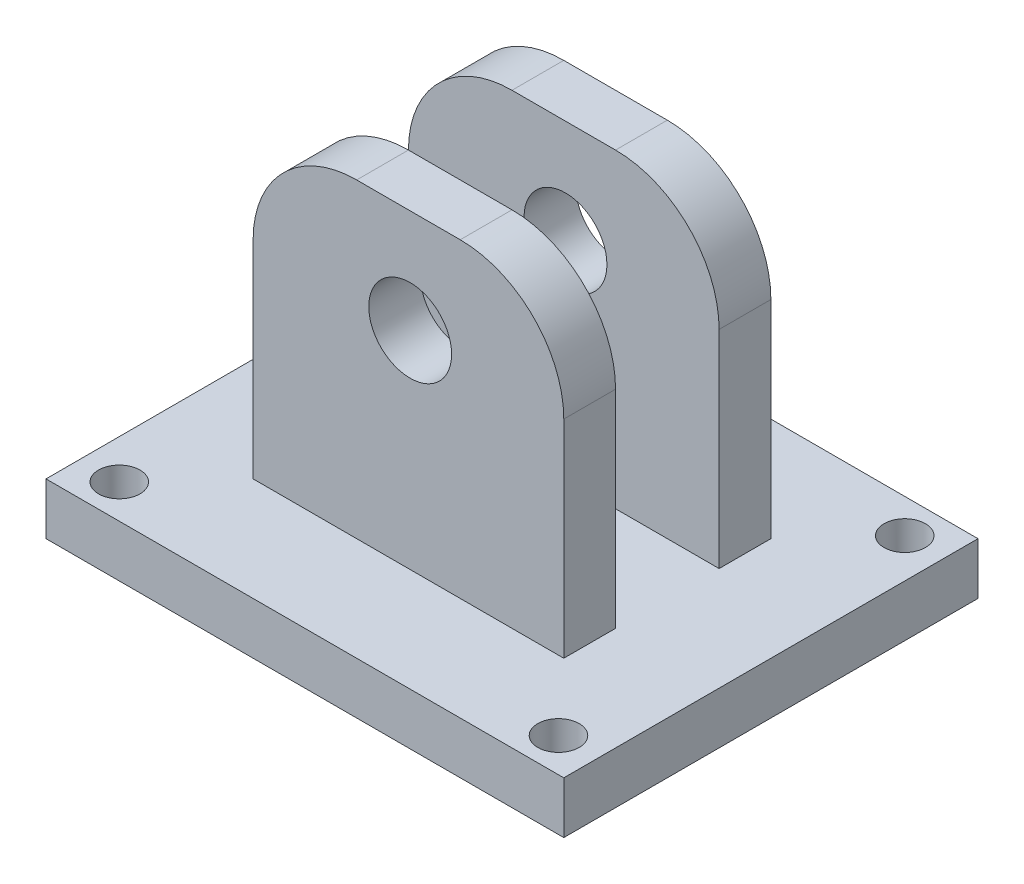
ISO-10303-21;
HEADER;
FILE_DESCRIPTION(('STEP AP214'),'2;1');
FILE_NAME('part.step','',(''),(''),'','','');
FILE_SCHEMA(('AUTOMOTIVE_DESIGN { 1 0 10303 214 1 1 1 1 }'));
ENDSEC;
DATA;
#1=APPLICATION_CONTEXT('core data for automotive mechanical design processes');
#2=APPLICATION_PROTOCOL_DEFINITION('international standard','automotive_design',2000,#1);
#3=PRODUCT_CONTEXT('',#1,'mechanical');
#4=PRODUCT('Part','Part','',(#3));
#5=PRODUCT_RELATED_PRODUCT_CATEGORY('part','',(#4));
#6=PRODUCT_DEFINITION_FORMATION('','',#4);
#7=PRODUCT_DEFINITION_CONTEXT('part definition',#1,'design');
#8=PRODUCT_DEFINITION('design','',#6,#7);
#9=PRODUCT_DEFINITION_SHAPE('','',#8);
#10=(LENGTH_UNIT() NAMED_UNIT(*) SI_UNIT(.MILLI.,.METRE.));
#11=(NAMED_UNIT(*) PLANE_ANGLE_UNIT() SI_UNIT($,.RADIAN.));
#12=(NAMED_UNIT(*) SI_UNIT($,.STERADIAN.) SOLID_ANGLE_UNIT());
#13=UNCERTAINTY_MEASURE_WITH_UNIT(LENGTH_MEASURE(1.E-05),#10,'distance_accuracy_value','');
#14=(GEOMETRIC_REPRESENTATION_CONTEXT(3) GLOBAL_UNCERTAINTY_ASSIGNED_CONTEXT((#13)) GLOBAL_UNIT_ASSIGNED_CONTEXT((#10,
#11,#12)) REPRESENTATION_CONTEXT('',''));
#15=CARTESIAN_POINT('',(0.,0.,0.));
#16=DIRECTION('',(0.,0.,1.));
#17=DIRECTION('',(1.,0.,0.));
#18=AXIS2_PLACEMENT_3D('',#15,#16,#17);
#19=CARTESIAN_POINT('',(7.66798418972334,25.,-2.15415019762846));
#20=DIRECTION('',(0.,0.,-1.));
#21=DIRECTION('',(-1.,0.,0.));
#22=AXIS2_PLACEMENT_3D('',#19,#20,#21);
#23=CYLINDRICAL_SURFACE('',#22,10.);
#24=DIRECTION('',(0.,0.,1.));
#25=VECTOR('',#24,1.);
#26=CARTESIAN_POINT('',(17.6679841897233,25.,-2.15415019762846));
#27=LINE('',#26,#25);
#28=CARTESIAN_POINT('',(17.6679841897233,25.,-2.15415019762846));
#29=VERTEX_POINT('',#28);
#30=CARTESIAN_POINT('',(17.6679841897233,25.,2.84584980237154));
#31=VERTEX_POINT('',#30);
#32=EDGE_CURVE('E263',#29,#31,#27,.T.);
#33=ORIENTED_EDGE('',*,*,#32,.F.);
#34=CARTESIAN_POINT('',(7.66798418972334,25.,-2.15415019762846));
#35=DIRECTION('',(0.,0.,1.));
#36=DIRECTION('',(1.,0.,0.));
#37=AXIS2_PLACEMENT_3D('',#34,#35,#36);
#38=CIRCLE('',#37,10.);
#39=CARTESIAN_POINT('',(7.66798418972334,35.,-2.15415019762846));
#40=VERTEX_POINT('',#39);
#41=EDGE_CURVE('E40',#40,#29,#38,.F.);
#42=ORIENTED_EDGE('',*,*,#41,.F.);
#43=DIRECTION('',(0.,0.,1.));
#44=VECTOR('',#43,1.);
#45=CARTESIAN_POINT('',(7.66798418972334,35.,-2.15415019762846));
#46=LINE('',#45,#44);
#47=CARTESIAN_POINT('',(7.66798418972334,35.,2.84584980237154));
#48=VERTEX_POINT('',#47);
#49=EDGE_CURVE('E266',#48,#40,#46,.F.);
#50=ORIENTED_EDGE('',*,*,#49,.F.);
#51=CARTESIAN_POINT('',(7.66798418972334,25.,2.84584980237154));
#52=DIRECTION('',(0.,0.,-1.));
#53=DIRECTION('',(-1.,0.,0.));
#54=AXIS2_PLACEMENT_3D('',#51,#52,#53);
#55=CIRCLE('',#54,10.);
#56=EDGE_CURVE('E11',#31,#48,#55,.F.);
#57=ORIENTED_EDGE('',*,*,#56,.F.);
#58=EDGE_LOOP('',(#33,#42,#50,#57));
#59=FACE_BOUND('',#58,.T.);
#60=ADVANCED_FACE('F32',(#59),#23,.T.);
#61=CARTESIAN_POINT('',(-2.33201581027666,25.,-2.15415019762846));
#62=DIRECTION('',(0.,0.,1.));
#63=DIRECTION('',(1.,0.,0.));
#64=AXIS2_PLACEMENT_3D('',#61,#62,#63);
#65=CYLINDRICAL_SURFACE('',#64,10.);
#66=DIRECTION('',(0.,0.,-1.));
#67=VECTOR('',#66,1.);
#68=CARTESIAN_POINT('',(-12.3320158102767,25.,-2.15415019762846));
#69=LINE('',#68,#67);
#70=CARTESIAN_POINT('',(-12.3320158102767,25.,2.84584980237154));
#71=VERTEX_POINT('',#70);
#72=CARTESIAN_POINT('',(-12.3320158102767,25.,-2.15415019762846));
#73=VERTEX_POINT('',#72);
#74=EDGE_CURVE('E153',#71,#73,#69,.T.);
#75=ORIENTED_EDGE('',*,*,#74,.F.);
#76=CARTESIAN_POINT('',(-2.33201581027666,25.,2.84584980237154));
#77=DIRECTION('',(0.,0.,-1.));
#78=DIRECTION('',(-1.,0.,0.));
#79=AXIS2_PLACEMENT_3D('',#76,#77,#78);
#80=CIRCLE('',#79,10.);
#81=CARTESIAN_POINT('',(-2.33201581027666,35.,2.84584980237154));
#82=VERTEX_POINT('',#81);
#83=EDGE_CURVE('E259',#82,#71,#80,.F.);
#84=ORIENTED_EDGE('',*,*,#83,.F.);
#85=DIRECTION('',(0.,0.,-1.));
#86=VECTOR('',#85,1.);
#87=CARTESIAN_POINT('',(-2.33201581027666,35.,-2.15415019762846));
#88=LINE('',#87,#86);
#89=CARTESIAN_POINT('',(-2.33201581027666,35.,-2.15415019762846));
#90=VERTEX_POINT('',#89);
#91=EDGE_CURVE('E256',#90,#82,#88,.F.);
#92=ORIENTED_EDGE('',*,*,#91,.F.);
#93=CARTESIAN_POINT('',(-2.33201581027666,25.,-2.15415019762846));
#94=DIRECTION('',(0.,0.,1.));
#95=DIRECTION('',(1.,0.,0.));
#96=AXIS2_PLACEMENT_3D('',#93,#94,#95);
#97=CIRCLE('',#96,10.);
#98=EDGE_CURVE('E261',#73,#90,#97,.F.);
#99=ORIENTED_EDGE('',*,*,#98,.F.);
#100=EDGE_LOOP('',(#75,#84,#92,#99));
#101=FACE_BOUND('',#100,.T.);
#102=ADVANCED_FACE('F314',(#101),#65,.T.);
#103=CARTESIAN_POINT('',(-2.33201581027666,25.,0.));
#104=DIRECTION('',(0.,0.,-1.));
#105=DIRECTION('',(-1.,0.,0.));
#106=AXIS2_PLACEMENT_3D('',#103,#104,#105);
#107=CYLINDRICAL_SURFACE('',#106,10.);
#108=DIRECTION('',(0.,0.,1.));
#109=VECTOR('',#108,1.);
#110=CARTESIAN_POINT('',(-2.33201581027666,35.,0.));
#111=LINE('',#110,#109);
#112=CARTESIAN_POINT('',(-2.33201581027666,35.,12.8458498023715));
#113=VERTEX_POINT('',#112);
#114=CARTESIAN_POINT('',(-2.33201581027666,35.,17.8458498023715));
#115=VERTEX_POINT('',#114);
#116=EDGE_CURVE('E245',#113,#115,#111,.T.);
#117=ORIENTED_EDGE('',*,*,#116,.F.);
#118=CARTESIAN_POINT('',(-2.33201581027666,25.,12.8458498023715));
#119=DIRECTION('',(0.,0.,1.));
#120=DIRECTION('',(1.,0.,0.));
#121=AXIS2_PLACEMENT_3D('',#118,#119,#120);
#122=CIRCLE('',#121,10.);
#123=CARTESIAN_POINT('',(-12.3320158102767,25.,12.8458498023715));
#124=VERTEX_POINT('',#123);
#125=EDGE_CURVE('E251',#124,#113,#122,.F.);
#126=ORIENTED_EDGE('',*,*,#125,.F.);
#127=DIRECTION('',(0.,0.,1.));
#128=VECTOR('',#127,1.);
#129=CARTESIAN_POINT('',(-12.3320158102767,25.,0.));
#130=LINE('',#129,#128);
#131=CARTESIAN_POINT('',(-12.3320158102767,25.,17.8458498023715));
#132=VERTEX_POINT('',#131);
#133=EDGE_CURVE('E248',#132,#124,#130,.F.);
#134=ORIENTED_EDGE('',*,*,#133,.F.);
#135=CARTESIAN_POINT('',(-2.33201581027666,25.,17.8458498023715));
#136=DIRECTION('',(0.,0.,-1.));
#137=DIRECTION('',(-1.,0.,0.));
#138=AXIS2_PLACEMENT_3D('',#135,#136,#137);
#139=CIRCLE('',#138,10.);
#140=EDGE_CURVE('E253',#115,#132,#139,.F.);
#141=ORIENTED_EDGE('',*,*,#140,.F.);
#142=EDGE_LOOP('',(#117,#126,#134,#141));
#143=FACE_BOUND('',#142,.T.);
#144=ADVANCED_FACE('F321',(#143),#107,.T.);
#145=CARTESIAN_POINT('',(7.66798418972334,25.,0.));
#146=DIRECTION('',(0.,0.,1.));
#147=DIRECTION('',(1.,0.,0.));
#148=AXIS2_PLACEMENT_3D('',#145,#146,#147);
#149=CYLINDRICAL_SURFACE('',#148,10.);
#150=DIRECTION('',(0.,0.,-1.));
#151=VECTOR('',#150,1.);
#152=CARTESIAN_POINT('',(7.66798418972334,35.,0.));
#153=LINE('',#152,#151);
#154=CARTESIAN_POINT('',(7.66798418972334,35.,17.8458498023715));
#155=VERTEX_POINT('',#154);
#156=CARTESIAN_POINT('',(7.66798418972334,35.,12.8458498023715));
#157=VERTEX_POINT('',#156);
#158=EDGE_CURVE('E234',#155,#157,#153,.T.);
#159=ORIENTED_EDGE('',*,*,#158,.F.);
#160=CARTESIAN_POINT('',(7.66798418972334,25.,17.8458498023715));
#161=DIRECTION('',(0.,0.,-1.));
#162=DIRECTION('',(-1.,0.,0.));
#163=AXIS2_PLACEMENT_3D('',#160,#161,#162);
#164=CIRCLE('',#163,10.);
#165=CARTESIAN_POINT('',(17.6679841897233,25.,17.8458498023715));
#166=VERTEX_POINT('',#165);
#167=EDGE_CURVE('E240',#166,#155,#164,.F.);
#168=ORIENTED_EDGE('',*,*,#167,.F.);
#169=DIRECTION('',(0.,0.,-1.));
#170=VECTOR('',#169,1.);
#171=CARTESIAN_POINT('',(17.6679841897233,25.,0.));
#172=LINE('',#171,#170);
#173=CARTESIAN_POINT('',(17.6679841897233,25.,12.8458498023715));
#174=VERTEX_POINT('',#173);
#175=EDGE_CURVE('E237',#174,#166,#172,.F.);
#176=ORIENTED_EDGE('',*,*,#175,.F.);
#177=CARTESIAN_POINT('',(7.66798418972334,25.,12.8458498023715));
#178=DIRECTION('',(0.,0.,1.));
#179=DIRECTION('',(1.,0.,0.));
#180=AXIS2_PLACEMENT_3D('',#177,#178,#179);
#181=CIRCLE('',#180,10.);
#182=EDGE_CURVE('E243',#157,#174,#181,.F.);
#183=ORIENTED_EDGE('',*,*,#182,.F.);
#184=EDGE_LOOP('',(#159,#168,#176,#183));
#185=FACE_BOUND('',#184,.T.);
#186=ADVANCED_FACE('F325',(#185),#149,.T.);
#187=CARTESIAN_POINT('',(0.,5.,0.));
#188=DIRECTION('',(0.,1.,0.));
#189=DIRECTION('',(0.,0.,1.));
#190=AXIS2_PLACEMENT_3D('',#187,#188,#189);
#191=PLANE('',#190);
#192=CARTESIAN_POINT('',(-18.5379838241973,5.,24.5644990119089));
#193=DIRECTION('',(0.,1.,0.));
#194=DIRECTION('',(0.,0.,-1.));
#195=AXIS2_PLACEMENT_3D('',#192,#193,#194);
#196=CIRCLE('',#195,2.);
#197=CARTESIAN_POINT('',(-18.5379838241973,5.,22.5644990119089));
#198=VERTEX_POINT('',#197);
#199=EDGE_CURVE('E410',#198,#198,#196,.T.);
#200=ORIENTED_EDGE('',*,*,#199,.F.);
#201=EDGE_LOOP('',(#200));
#202=FACE_BOUND('',#201,.T.);
#203=CARTESIAN_POINT('',(23.873952203644,5.,-8.87279940716586));
#204=DIRECTION('',(0.,1.,0.));
#205=DIRECTION('',(0.,0.,-1.));
#206=AXIS2_PLACEMENT_3D('',#203,#204,#205);
#207=CIRCLE('',#206,2.);
#208=CARTESIAN_POINT('',(23.873952203644,5.,-10.8727994071659));
#209=VERTEX_POINT('',#208);
#210=EDGE_CURVE('E411',#209,#209,#207,.T.);
#211=ORIENTED_EDGE('',*,*,#210,.F.);
#212=EDGE_LOOP('',(#211));
#213=FACE_BOUND('',#212,.T.);
#214=CARTESIAN_POINT('',(23.873952203644,5.,24.5644990119089));
#215=DIRECTION('',(0.,1.,0.));
#216=DIRECTION('',(0.,0.,1.));
#217=AXIS2_PLACEMENT_3D('',#214,#215,#216);
#218=CIRCLE('',#217,2.);
#219=CARTESIAN_POINT('',(23.873952203644,5.,26.5644990119089));
#220=VERTEX_POINT('',#219);
#221=EDGE_CURVE('E281',#220,#220,#218,.T.);
#222=ORIENTED_EDGE('',*,*,#221,.F.);
#223=EDGE_LOOP('',(#222));
#224=FACE_BOUND('',#223,.T.);
#225=CARTESIAN_POINT('',(-18.5379838241973,5.,-8.87279940716584));
#226=DIRECTION('',(0.,1.,0.));
#227=DIRECTION('',(0.,0.,1.));
#228=AXIS2_PLACEMENT_3D('',#225,#226,#227);
#229=CIRCLE('',#228,2.);
#230=CARTESIAN_POINT('',(-18.5379838241973,5.,-6.87279940716584));
#231=VERTEX_POINT('',#230);
#232=EDGE_CURVE('E277',#231,#231,#229,.T.);
#233=ORIENTED_EDGE('',*,*,#232,.F.);
#234=EDGE_LOOP('',(#233));
#235=FACE_BOUND('',#234,.T.);
#236=DIRECTION('',(0.,0.,1.));
#237=VECTOR('',#236,1.);
#238=CARTESIAN_POINT('',(-22.3320158102767,5.,-12.1541501976285));
#239=LINE('',#238,#237);
#240=CARTESIAN_POINT('',(-22.3320158102767,5.,-12.1541501976285));
#241=VERTEX_POINT('',#240);
#242=CARTESIAN_POINT('',(-22.3320158102767,5.,27.8458498023715));
#243=VERTEX_POINT('',#242);
#244=EDGE_CURVE('E203',#241,#243,#239,.T.);
#245=ORIENTED_EDGE('',*,*,#244,.T.);
#246=DIRECTION('',(1.,0.,0.));
#247=VECTOR('',#246,1.);
#248=CARTESIAN_POINT('',(-22.3320158102767,5.,27.8458498023715));
#249=LINE('',#248,#247);
#250=CARTESIAN_POINT('',(27.6679841897234,5.,27.8458498023715));
#251=VERTEX_POINT('',#250);
#252=EDGE_CURVE('E206',#243,#251,#249,.T.);
#253=ORIENTED_EDGE('',*,*,#252,.T.);
#254=DIRECTION('',(0.,0.,1.));
#255=VECTOR('',#254,1.);
#256=CARTESIAN_POINT('',(27.6679841897233,5.,-12.1541501976285));
#257=LINE('',#256,#255);
#258=CARTESIAN_POINT('',(27.6679841897233,5.,-12.1541501976285));
#259=VERTEX_POINT('',#258);
#260=EDGE_CURVE('E209',#259,#251,#257,.T.);
#261=ORIENTED_EDGE('',*,*,#260,.F.);
#262=DIRECTION('',(1.,0.,0.));
#263=VECTOR('',#262,1.);
#264=CARTESIAN_POINT('',(-22.3320158102767,5.,-12.1541501976285));
#265=LINE('',#264,#263);
#266=EDGE_CURVE('E212',#241,#259,#265,.T.);
#267=ORIENTED_EDGE('',*,*,#266,.F.);
#268=EDGE_LOOP('',(#245,#253,#261,#267));
#269=FACE_BOUND('',#268,.T.);
#270=DIRECTION('',(-1.,0.,0.));
#271=VECTOR('',#270,1.);
#272=CARTESIAN_POINT('',(0.,5.,17.8458498023715));
#273=LINE('',#272,#271);
#274=CARTESIAN_POINT('',(17.6679841897233,5.,17.8458498023715));
#275=VERTEX_POINT('',#274);
#276=CARTESIAN_POINT('',(-12.3320158102767,5.,17.8458498023715));
#277=VERTEX_POINT('',#276);
#278=EDGE_CURVE('E196',#275,#277,#273,.T.);
#279=ORIENTED_EDGE('',*,*,#278,.T.);
#280=DIRECTION('',(0.,0.,-1.));
#281=VECTOR('',#280,1.);
#282=CARTESIAN_POINT('',(-12.3320158102767,5.,0.));
#283=LINE('',#282,#281);
#284=CARTESIAN_POINT('',(-12.3320158102767,5.,12.8458498023715));
#285=VERTEX_POINT('',#284);
#286=EDGE_CURVE('E199',#277,#285,#283,.T.);
#287=ORIENTED_EDGE('',*,*,#286,.T.);
#288=DIRECTION('',(1.,0.,0.));
#289=VECTOR('',#288,1.);
#290=CARTESIAN_POINT('',(0.,5.,12.8458498023715));
#291=LINE('',#290,#289);
#292=CARTESIAN_POINT('',(17.6679841897233,5.,12.8458498023715));
#293=VERTEX_POINT('',#292);
#294=EDGE_CURVE('E190',#285,#293,#291,.T.);
#295=ORIENTED_EDGE('',*,*,#294,.T.);
#296=DIRECTION('',(0.,0.,1.));
#297=VECTOR('',#296,1.);
#298=CARTESIAN_POINT('',(17.6679841897233,5.,0.));
#299=LINE('',#298,#297);
#300=EDGE_CURVE('E193',#293,#275,#299,.T.);
#301=ORIENTED_EDGE('',*,*,#300,.T.);
#302=EDGE_LOOP('',(#279,#287,#295,#301));
#303=FACE_BOUND('',#302,.T.);
#304=DIRECTION('',(-1.,0.,0.));
#305=VECTOR('',#304,1.);
#306=CARTESIAN_POINT('',(0.,5.,2.84584980237154));
#307=LINE('',#306,#305);
#308=CARTESIAN_POINT('',(17.6679841897233,5.,2.84584980237154));
#309=VERTEX_POINT('',#308);
#310=CARTESIAN_POINT('',(-12.3320158102767,5.,2.84584980237154));
#311=VERTEX_POINT('',#310);
#312=EDGE_CURVE('E172',#309,#311,#307,.T.);
#313=ORIENTED_EDGE('',*,*,#312,.T.);
#314=DIRECTION('',(0.,0.,-1.));
#315=VECTOR('',#314,1.);
#316=CARTESIAN_POINT('',(-12.3320158102767,5.,0.));
#317=LINE('',#316,#315);
#318=CARTESIAN_POINT('',(-12.3320158102767,5.,-2.15415019762846));
#319=VERTEX_POINT('',#318);
#320=EDGE_CURVE('E150',#311,#319,#317,.T.);
#321=ORIENTED_EDGE('',*,*,#320,.T.);
#322=DIRECTION('',(1.,0.,0.));
#323=VECTOR('',#322,1.);
#324=CARTESIAN_POINT('',(0.,5.,-2.15415019762846));
#325=LINE('',#324,#323);
#326=CARTESIAN_POINT('',(17.6679841897233,5.,-2.15415019762846));
#327=VERTEX_POINT('',#326);
#328=EDGE_CURVE('E160',#319,#327,#325,.T.);
#329=ORIENTED_EDGE('',*,*,#328,.T.);
#330=DIRECTION('',(0.,0.,1.));
#331=VECTOR('',#330,1.);
#332=CARTESIAN_POINT('',(17.6679841897233,5.,0.));
#333=LINE('',#332,#331);
#334=EDGE_CURVE('E167',#327,#309,#333,.T.);
#335=ORIENTED_EDGE('',*,*,#334,.T.);
#336=EDGE_LOOP('',(#313,#321,#329,#335));
#337=FACE_BOUND('',#336,.T.);
#338=ADVANCED_FACE('F170',(#202,#213,#224,#235,#269,#303,#337),#191,.T.);
#339=CARTESIAN_POINT('',(-22.3320158102767,5.,-12.1541501976285));
#340=DIRECTION('',(1.,0.,0.));
#341=DIRECTION('',(0.,0.,-1.));
#342=AXIS2_PLACEMENT_3D('',#339,#340,#341);
#343=PLANE('',#342);
#344=DIRECTION('',(0.,0.,1.));
#345=VECTOR('',#344,1.);
#346=CARTESIAN_POINT('',(-22.3320158102767,0.,-12.1541501976285));
#347=LINE('',#346,#345);
#348=CARTESIAN_POINT('',(-22.3320158102767,0.,-12.1541501976285));
#349=VERTEX_POINT('',#348);
#350=CARTESIAN_POINT('',(-22.3320158102767,0.,27.8458498023715));
#351=VERTEX_POINT('',#350);
#352=EDGE_CURVE('E202',#349,#351,#347,.T.);
#353=ORIENTED_EDGE('',*,*,#352,.T.);
#354=DIRECTION('',(0.,-1.,0.));
#355=VECTOR('',#354,1.);
#356=CARTESIAN_POINT('',(-22.3320158102767,5.,27.8458498023715));
#357=LINE('',#356,#355);
#358=EDGE_CURVE('E231',#243,#351,#357,.T.);
#359=ORIENTED_EDGE('',*,*,#358,.F.);
#360=ORIENTED_EDGE('',*,*,#244,.F.);
#361=DIRECTION('',(0.,-1.,0.));
#362=VECTOR('',#361,1.);
#363=CARTESIAN_POINT('',(-22.3320158102767,5.,-12.1541501976285));
#364=LINE('',#363,#362);
#365=EDGE_CURVE('E215',#241,#349,#364,.T.);
#366=ORIENTED_EDGE('',*,*,#365,.T.);
#367=EDGE_LOOP('',(#353,#359,#360,#366));
#368=FACE_BOUND('',#367,.T.);
#369=ADVANCED_FACE('F332',(#368),#343,.F.);
#370=CARTESIAN_POINT('',(-22.3320158102767,5.,27.8458498023715));
#371=DIRECTION('',(0.,0.,-1.));
#372=DIRECTION('',(-1.,0.,0.));
#373=AXIS2_PLACEMENT_3D('',#370,#371,#372);
#374=PLANE('',#373);
#375=DIRECTION('',(1.,0.,0.));
#376=VECTOR('',#375,1.);
#377=CARTESIAN_POINT('',(-22.3320158102767,0.,27.8458498023715));
#378=LINE('',#377,#376);
#379=CARTESIAN_POINT('',(27.6679841897234,0.,27.8458498023715));
#380=VERTEX_POINT('',#379);
#381=EDGE_CURVE('E218',#351,#380,#378,.T.);
#382=ORIENTED_EDGE('',*,*,#381,.T.);
#383=DIRECTION('',(0.,-1.,0.));
#384=VECTOR('',#383,1.);
#385=CARTESIAN_POINT('',(27.6679841897234,5.,27.8458498023715));
#386=LINE('',#385,#384);
#387=EDGE_CURVE('E229',#251,#380,#386,.T.);
#388=ORIENTED_EDGE('',*,*,#387,.F.);
#389=ORIENTED_EDGE('',*,*,#252,.F.);
#390=ORIENTED_EDGE('',*,*,#358,.T.);
#391=EDGE_LOOP('',(#382,#388,#389,#390));
#392=FACE_BOUND('',#391,.T.);
#393=ADVANCED_FACE('F335',(#392),#374,.F.);
#394=CARTESIAN_POINT('',(27.6679841897233,5.,-12.1541501976285));
#395=DIRECTION('',(1.,0.,0.));
#396=DIRECTION('',(0.,0.,-1.));
#397=AXIS2_PLACEMENT_3D('',#394,#395,#396);
#398=PLANE('',#397);
#399=DIRECTION('',(0.,0.,1.));
#400=VECTOR('',#399,1.);
#401=CARTESIAN_POINT('',(27.6679841897233,0.,-12.1541501976285));
#402=LINE('',#401,#400);
#403=CARTESIAN_POINT('',(27.6679841897233,0.,-12.1541501976285));
#404=VERTEX_POINT('',#403);
#405=EDGE_CURVE('E221',#404,#380,#402,.T.);
#406=ORIENTED_EDGE('',*,*,#405,.F.);
#407=DIRECTION('',(0.,-1.,0.));
#408=VECTOR('',#407,1.);
#409=CARTESIAN_POINT('',(27.6679841897233,5.,-12.1541501976285));
#410=LINE('',#409,#408);
#411=EDGE_CURVE('E227',#259,#404,#410,.T.);
#412=ORIENTED_EDGE('',*,*,#411,.F.);
#413=ORIENTED_EDGE('',*,*,#260,.T.);
#414=ORIENTED_EDGE('',*,*,#387,.T.);
#415=EDGE_LOOP('',(#406,#412,#413,#414));
#416=FACE_BOUND('',#415,.T.);
#417=ADVANCED_FACE('F339',(#416),#398,.T.);
#418=CARTESIAN_POINT('',(-22.3320158102767,5.,-12.1541501976285));
#419=DIRECTION('',(0.,0.,-1.));
#420=DIRECTION('',(-1.,0.,0.));
#421=AXIS2_PLACEMENT_3D('',#418,#419,#420);
#422=PLANE('',#421);
#423=DIRECTION('',(1.,0.,0.));
#424=VECTOR('',#423,1.);
#425=CARTESIAN_POINT('',(-22.3320158102767,0.,-12.1541501976285));
#426=LINE('',#425,#424);
#427=EDGE_CURVE('E207',#349,#404,#426,.T.);
#428=ORIENTED_EDGE('',*,*,#427,.F.);
#429=ORIENTED_EDGE('',*,*,#365,.F.);
#430=ORIENTED_EDGE('',*,*,#266,.T.);
#431=ORIENTED_EDGE('',*,*,#411,.T.);
#432=EDGE_LOOP('',(#428,#429,#430,#431));
#433=FACE_BOUND('',#432,.T.);
#434=ADVANCED_FACE('F343',(#433),#422,.T.);
#435=CARTESIAN_POINT('',(0.,0.,0.));
#436=DIRECTION('',(0.,1.,0.));
#437=DIRECTION('',(0.,0.,1.));
#438=AXIS2_PLACEMENT_3D('',#435,#436,#437);
#439=PLANE('',#438);
#440=CARTESIAN_POINT('',(-18.5379838241973,0.,24.5644990119089));
#441=DIRECTION('',(0.,1.,0.));
#442=DIRECTION('',(0.,0.,1.));
#443=AXIS2_PLACEMENT_3D('',#440,#441,#442);
#444=CIRCLE('',#443,2.);
#445=CARTESIAN_POINT('',(-18.5379838241973,0.,26.5644990119089));
#446=VERTEX_POINT('',#445);
#447=EDGE_CURVE('E35',#446,#446,#444,.T.);
#448=ORIENTED_EDGE('',*,*,#447,.T.);
#449=EDGE_LOOP('',(#448));
#450=FACE_BOUND('',#449,.T.);
#451=CARTESIAN_POINT('',(23.873952203644,0.,-8.87279940716586));
#452=DIRECTION('',(0.,1.,0.));
#453=DIRECTION('',(0.,0.,1.));
#454=AXIS2_PLACEMENT_3D('',#451,#452,#453);
#455=CIRCLE('',#454,2.);
#456=CARTESIAN_POINT('',(23.873952203644,0.,-6.87279940716585));
#457=VERTEX_POINT('',#456);
#458=EDGE_CURVE('E280',#457,#457,#455,.T.);
#459=ORIENTED_EDGE('',*,*,#458,.T.);
#460=EDGE_LOOP('',(#459));
#461=FACE_BOUND('',#460,.T.);
#462=CARTESIAN_POINT('',(23.873952203644,0.,24.5644990119089));
#463=DIRECTION('',(0.,1.,0.));
#464=DIRECTION('',(0.,0.,1.));
#465=AXIS2_PLACEMENT_3D('',#462,#463,#464);
#466=CIRCLE('',#465,2.);
#467=CARTESIAN_POINT('',(23.873952203644,0.,26.5644990119089));
#468=VERTEX_POINT('',#467);
#469=EDGE_CURVE('E278',#468,#468,#466,.T.);
#470=ORIENTED_EDGE('',*,*,#469,.T.);
#471=EDGE_LOOP('',(#470));
#472=FACE_BOUND('',#471,.T.);
#473=CARTESIAN_POINT('',(-18.5379838241973,0.,-8.87279940716584));
#474=DIRECTION('',(0.,1.,0.));
#475=DIRECTION('',(0.,0.,1.));
#476=AXIS2_PLACEMENT_3D('',#473,#474,#475);
#477=CIRCLE('',#476,2.);
#478=CARTESIAN_POINT('',(-18.5379838241973,0.,-6.87279940716584));
#479=VERTEX_POINT('',#478);
#480=EDGE_CURVE('E274',#479,#479,#477,.T.);
#481=ORIENTED_EDGE('',*,*,#480,.T.);
#482=EDGE_LOOP('',(#481));
#483=FACE_BOUND('',#482,.T.);
#484=ORIENTED_EDGE('',*,*,#352,.F.);
#485=ORIENTED_EDGE('',*,*,#427,.T.);
#486=ORIENTED_EDGE('',*,*,#405,.T.);
#487=ORIENTED_EDGE('',*,*,#381,.F.);
#488=EDGE_LOOP('',(#484,#485,#486,#487));
#489=FACE_BOUND('',#488,.T.);
#490=ADVANCED_FACE('F347',(#450,#461,#472,#483,#489),#439,.F.);
#491=CARTESIAN_POINT('',(-12.3320158102767,35.,12.8458498023715));
#492=DIRECTION('',(1.,0.,0.));
#493=DIRECTION('',(0.,0.,-1.));
#494=AXIS2_PLACEMENT_3D('',#491,#492,#493);
#495=PLANE('',#494);
#496=DIRECTION('',(0.,-1.,0.));
#497=VECTOR('',#496,1.);
#498=CARTESIAN_POINT('',(-12.3320158102767,35.,17.8458498023715));
#499=LINE('',#498,#497);
#500=EDGE_CURVE('E188',#132,#277,#499,.T.);
#501=ORIENTED_EDGE('',*,*,#500,.F.);
#502=ORIENTED_EDGE('',*,*,#133,.T.);
#503=DIRECTION('',(0.,-1.,0.));
#504=VECTOR('',#503,1.);
#505=CARTESIAN_POINT('',(-12.3320158102767,35.,12.8458498023715));
#506=LINE('',#505,#504);
#507=EDGE_CURVE('E182',#124,#285,#506,.T.);
#508=ORIENTED_EDGE('',*,*,#507,.T.);
#509=ORIENTED_EDGE('',*,*,#286,.F.);
#510=EDGE_LOOP('',(#501,#502,#508,#509));
#511=FACE_BOUND('',#510,.T.);
#512=ADVANCED_FACE('F351',(#511),#495,.F.);
#513=CARTESIAN_POINT('',(-12.3320158102767,35.,17.8458498023715));
#514=DIRECTION('',(0.,0.,-1.));
#515=DIRECTION('',(-1.,0.,0.));
#516=AXIS2_PLACEMENT_3D('',#513,#514,#515);
#517=PLANE('',#516);
#518=CARTESIAN_POINT('',(2.83417663942907,25.,17.8458498023715));
#519=DIRECTION('',(0.,0.,1.));
#520=DIRECTION('',(1.,0.,0.));
#521=AXIS2_PLACEMENT_3D('',#518,#519,#520);
#522=CIRCLE('',#521,4.);
#523=CARTESIAN_POINT('',(6.83417663942907,25.,17.8458498023715));
#524=VERTEX_POINT('',#523);
#525=EDGE_CURVE('E273',#524,#524,#522,.T.);
#526=ORIENTED_EDGE('',*,*,#525,.F.);
#527=EDGE_LOOP('',(#526));
#528=FACE_BOUND('',#527,.T.);
#529=DIRECTION('',(1.,0.,0.));
#530=VECTOR('',#529,1.);
#531=CARTESIAN_POINT('',(-12.3320158102767,35.,17.8458498023715));
#532=LINE('',#531,#530);
#533=EDGE_CURVE('E173',#115,#155,#532,.T.);
#534=ORIENTED_EDGE('',*,*,#533,.F.);
#535=ORIENTED_EDGE('',*,*,#140,.T.);
#536=ORIENTED_EDGE('',*,*,#500,.T.);
#537=ORIENTED_EDGE('',*,*,#278,.F.);
#538=DIRECTION('',(0.,-1.,0.));
#539=VECTOR('',#538,1.);
#540=CARTESIAN_POINT('',(17.6679841897233,35.,17.8458498023715));
#541=LINE('',#540,#539);
#542=EDGE_CURVE('E186',#166,#275,#541,.T.);
#543=ORIENTED_EDGE('',*,*,#542,.F.);
#544=ORIENTED_EDGE('',*,*,#167,.T.);
#545=EDGE_LOOP('',(#534,#535,#536,#537,#543,#544));
#546=FACE_BOUND('',#545,.T.);
#547=ADVANCED_FACE('F357',(#528,#546),#517,.F.);
#548=CARTESIAN_POINT('',(17.6679841897233,35.,12.8458498023715));
#549=DIRECTION('',(-1.,0.,0.));
#550=DIRECTION('',(0.,0.,1.));
#551=AXIS2_PLACEMENT_3D('',#548,#549,#550);
#552=PLANE('',#551);
#553=DIRECTION('',(0.,-1.,0.));
#554=VECTOR('',#553,1.);
#555=CARTESIAN_POINT('',(17.6679841897233,35.,12.8458498023715));
#556=LINE('',#555,#554);
#557=EDGE_CURVE('E184',#174,#293,#556,.T.);
#558=ORIENTED_EDGE('',*,*,#557,.F.);
#559=ORIENTED_EDGE('',*,*,#175,.T.);
#560=ORIENTED_EDGE('',*,*,#542,.T.);
#561=ORIENTED_EDGE('',*,*,#300,.F.);
#562=EDGE_LOOP('',(#558,#559,#560,#561));
#563=FACE_BOUND('',#562,.T.);
#564=ADVANCED_FACE('F361',(#563),#552,.F.);
#565=CARTESIAN_POINT('',(-12.3320158102767,35.,12.8458498023715));
#566=DIRECTION('',(0.,0.,1.));
#567=DIRECTION('',(1.,0.,0.));
#568=AXIS2_PLACEMENT_3D('',#565,#566,#567);
#569=PLANE('',#568);
#570=CARTESIAN_POINT('',(2.83417663942907,25.,12.8458498023715));
#571=DIRECTION('',(0.,0.,1.));
#572=DIRECTION('',(1.,0.,0.));
#573=AXIS2_PLACEMENT_3D('',#570,#571,#572);
#574=CIRCLE('',#573,4.);
#575=CARTESIAN_POINT('',(6.83417663942907,25.,12.8458498023715));
#576=VERTEX_POINT('',#575);
#577=EDGE_CURVE('E299',#576,#576,#574,.T.);
#578=ORIENTED_EDGE('',*,*,#577,.T.);
#579=EDGE_LOOP('',(#578));
#580=FACE_BOUND('',#579,.T.);
#581=ORIENTED_EDGE('',*,*,#507,.F.);
#582=ORIENTED_EDGE('',*,*,#125,.T.);
#583=DIRECTION('',(-1.,0.,0.));
#584=VECTOR('',#583,1.);
#585=CARTESIAN_POINT('',(-12.3320158102767,35.,12.8458498023715));
#586=LINE('',#585,#584);
#587=EDGE_CURVE('E175',#157,#113,#586,.T.);
#588=ORIENTED_EDGE('',*,*,#587,.F.);
#589=ORIENTED_EDGE('',*,*,#182,.T.);
#590=ORIENTED_EDGE('',*,*,#557,.T.);
#591=ORIENTED_EDGE('',*,*,#294,.F.);
#592=EDGE_LOOP('',(#581,#582,#588,#589,#590,#591));
#593=FACE_BOUND('',#592,.T.);
#594=ADVANCED_FACE('F365',(#580,#593),#569,.F.);
#595=CARTESIAN_POINT('',(0.,35.,0.));
#596=DIRECTION('',(0.,1.,0.));
#597=DIRECTION('',(0.,0.,1.));
#598=AXIS2_PLACEMENT_3D('',#595,#596,#597);
#599=PLANE('',#598);
#600=ORIENTED_EDGE('',*,*,#587,.T.);
#601=ORIENTED_EDGE('',*,*,#116,.T.);
#602=ORIENTED_EDGE('',*,*,#533,.T.);
#603=ORIENTED_EDGE('',*,*,#158,.T.);
#604=EDGE_LOOP('',(#600,#601,#602,#603));
#605=FACE_BOUND('',#604,.T.);
#606=ADVANCED_FACE('F369',(#605),#599,.T.);
#607=CARTESIAN_POINT('',(-12.3320158102767,35.,-2.15415019762846));
#608=DIRECTION('',(1.,0.,0.));
#609=DIRECTION('',(0.,0.,-1.));
#610=AXIS2_PLACEMENT_3D('',#607,#608,#609);
#611=PLANE('',#610);
#612=DIRECTION('',(0.,-1.,0.));
#613=VECTOR('',#612,1.);
#614=CARTESIAN_POINT('',(-12.3320158102767,35.,2.84584980237154));
#615=LINE('',#614,#613);
#616=EDGE_CURVE('E168',#71,#311,#615,.T.);
#617=ORIENTED_EDGE('',*,*,#616,.F.);
#618=ORIENTED_EDGE('',*,*,#74,.T.);
#619=DIRECTION('',(0.,-1.,0.));
#620=VECTOR('',#619,1.);
#621=CARTESIAN_POINT('',(-12.3320158102767,35.,-2.15415019762846));
#622=LINE('',#621,#620);
#623=EDGE_CURVE('E145',#73,#319,#622,.T.);
#624=ORIENTED_EDGE('',*,*,#623,.T.);
#625=ORIENTED_EDGE('',*,*,#320,.F.);
#626=EDGE_LOOP('',(#617,#618,#624,#625));
#627=FACE_BOUND('',#626,.T.);
#628=ADVANCED_FACE('F148',(#627),#611,.F.);
#629=CARTESIAN_POINT('',(-12.3320158102767,35.,2.84584980237154));
#630=DIRECTION('',(0.,0.,-1.));
#631=DIRECTION('',(-1.,0.,0.));
#632=AXIS2_PLACEMENT_3D('',#629,#630,#631);
#633=PLANE('',#632);
#634=CARTESIAN_POINT('',(2.83417663942907,25.,2.84584980237154));
#635=DIRECTION('',(0.,0.,-1.));
#636=DIRECTION('',(-1.,0.,0.));
#637=AXIS2_PLACEMENT_3D('',#634,#635,#636);
#638=CIRCLE('',#637,4.);
#639=CARTESIAN_POINT('',(-1.16582336057093,25.,2.84584980237154));
#640=VERTEX_POINT('',#639);
#641=EDGE_CURVE('E272',#640,#640,#638,.T.);
#642=ORIENTED_EDGE('',*,*,#641,.T.);
#643=EDGE_LOOP('',(#642));
#644=FACE_BOUND('',#643,.T.);
#645=DIRECTION('',(0.,-1.,0.));
#646=VECTOR('',#645,1.);
#647=CARTESIAN_POINT('',(17.6679841897233,35.,2.84584980237154));
#648=LINE('',#647,#646);
#649=EDGE_CURVE('E307',#31,#309,#648,.T.);
#650=ORIENTED_EDGE('',*,*,#649,.F.);
#651=ORIENTED_EDGE('',*,*,#56,.T.);
#652=DIRECTION('',(1.,0.,0.));
#653=VECTOR('',#652,1.);
#654=CARTESIAN_POINT('',(-12.3320158102767,35.,2.84584980237154));
#655=LINE('',#654,#653);
#656=EDGE_CURVE('E302',#82,#48,#655,.T.);
#657=ORIENTED_EDGE('',*,*,#656,.F.);
#658=ORIENTED_EDGE('',*,*,#83,.T.);
#659=ORIENTED_EDGE('',*,*,#616,.T.);
#660=ORIENTED_EDGE('',*,*,#312,.F.);
#661=EDGE_LOOP('',(#650,#651,#657,#658,#659,#660));
#662=FACE_BOUND('',#661,.T.);
#663=ADVANCED_FACE('F311',(#644,#662),#633,.F.);
#664=CARTESIAN_POINT('',(17.6679841897233,35.,-2.15415019762846));
#665=DIRECTION('',(-1.,0.,0.));
#666=DIRECTION('',(0.,0.,1.));
#667=AXIS2_PLACEMENT_3D('',#664,#665,#666);
#668=PLANE('',#667);
#669=DIRECTION('',(0.,-1.,0.));
#670=VECTOR('',#669,1.);
#671=CARTESIAN_POINT('',(17.6679841897233,35.,-2.15415019762846));
#672=LINE('',#671,#670);
#673=EDGE_CURVE('E156',#29,#327,#672,.T.);
#674=ORIENTED_EDGE('',*,*,#673,.F.);
#675=ORIENTED_EDGE('',*,*,#32,.T.);
#676=ORIENTED_EDGE('',*,*,#649,.T.);
#677=ORIENTED_EDGE('',*,*,#334,.F.);
#678=EDGE_LOOP('',(#674,#675,#676,#677));
#679=FACE_BOUND('',#678,.T.);
#680=ADVANCED_FACE('F310',(#679),#668,.F.);
#681=CARTESIAN_POINT('',(-12.3320158102767,35.,-2.15415019762846));
#682=DIRECTION('',(0.,0.,1.));
#683=DIRECTION('',(1.,0.,0.));
#684=AXIS2_PLACEMENT_3D('',#681,#682,#683);
#685=PLANE('',#684);
#686=CARTESIAN_POINT('',(2.83417663942907,25.,-2.15415019762846));
#687=DIRECTION('',(0.,0.,1.));
#688=DIRECTION('',(1.,0.,0.));
#689=AXIS2_PLACEMENT_3D('',#686,#687,#688);
#690=CIRCLE('',#689,4.);
#691=CARTESIAN_POINT('',(6.83417663942907,25.,-2.15415019762846));
#692=VERTEX_POINT('',#691);
#693=EDGE_CURVE('E269',#692,#692,#690,.T.);
#694=ORIENTED_EDGE('',*,*,#693,.T.);
#695=EDGE_LOOP('',(#694));
#696=FACE_BOUND('',#695,.T.);
#697=DIRECTION('',(-1.,0.,0.));
#698=VECTOR('',#697,1.);
#699=CARTESIAN_POINT('',(-12.3320158102767,35.,-2.15415019762846));
#700=LINE('',#699,#698);
#701=EDGE_CURVE('E157',#40,#90,#700,.T.);
#702=ORIENTED_EDGE('',*,*,#701,.F.);
#703=ORIENTED_EDGE('',*,*,#41,.T.);
#704=ORIENTED_EDGE('',*,*,#673,.T.);
#705=ORIENTED_EDGE('',*,*,#328,.F.);
#706=ORIENTED_EDGE('',*,*,#623,.F.);
#707=ORIENTED_EDGE('',*,*,#98,.T.);
#708=EDGE_LOOP('',(#702,#703,#704,#705,#706,#707));
#709=FACE_BOUND('',#708,.T.);
#710=ADVANCED_FACE('F162',(#696,#709),#685,.F.);
#711=CARTESIAN_POINT('',(0.,35.,0.));
#712=DIRECTION('',(0.,1.,0.));
#713=DIRECTION('',(0.,0.,1.));
#714=AXIS2_PLACEMENT_3D('',#711,#712,#713);
#715=PLANE('',#714);
#716=ORIENTED_EDGE('',*,*,#656,.T.);
#717=ORIENTED_EDGE('',*,*,#49,.T.);
#718=ORIENTED_EDGE('',*,*,#701,.T.);
#719=ORIENTED_EDGE('',*,*,#91,.T.);
#720=EDGE_LOOP('',(#716,#717,#718,#719));
#721=FACE_BOUND('',#720,.T.);
#722=ADVANCED_FACE('F316',(#721),#715,.T.);
#723=CARTESIAN_POINT('',(2.83417663942907,25.,-17.1541501976285));
#724=DIRECTION('',(0.,0.,1.));
#725=DIRECTION('',(1.,0.,0.));
#726=AXIS2_PLACEMENT_3D('',#723,#724,#725);
#727=CYLINDRICAL_SURFACE('',#726,4.);
#728=ORIENTED_EDGE('',*,*,#693,.F.);
#729=EDGE_LOOP('',(#728));
#730=FACE_BOUND('',#729,.T.);
#731=ORIENTED_EDGE('',*,*,#641,.F.);
#732=EDGE_LOOP('',(#731));
#733=FACE_BOUND('',#732,.T.);
#734=ADVANCED_FACE('F386',(#730,#733),#727,.F.);
#735=ORIENTED_EDGE('',*,*,#525,.T.);
#736=EDGE_LOOP('',(#735));
#737=FACE_BOUND('',#736,.T.);
#738=ORIENTED_EDGE('',*,*,#577,.F.);
#739=EDGE_LOOP('',(#738));
#740=FACE_BOUND('',#739,.T.);
#741=ADVANCED_FACE('F387',(#737,#740),#727,.F.);
#742=CARTESIAN_POINT('',(-18.5379838241973,-30.,-8.87279940716584));
#743=DIRECTION('',(0.,1.,0.));
#744=DIRECTION('',(0.,0.,1.));
#745=AXIS2_PLACEMENT_3D('',#742,#743,#744);
#746=CYLINDRICAL_SURFACE('',#745,2.);
#747=ORIENTED_EDGE('',*,*,#232,.T.);
#748=EDGE_LOOP('',(#747));
#749=FACE_BOUND('',#748,.T.);
#750=ORIENTED_EDGE('',*,*,#480,.F.);
#751=EDGE_LOOP('',(#750));
#752=FACE_BOUND('',#751,.T.);
#753=ADVANCED_FACE('F390',(#749,#752),#746,.F.);
#754=CARTESIAN_POINT('',(23.873952203644,-30.,24.5644990119089));
#755=DIRECTION('',(0.,1.,0.));
#756=DIRECTION('',(0.,0.,1.));
#757=AXIS2_PLACEMENT_3D('',#754,#755,#756);
#758=CYLINDRICAL_SURFACE('',#757,2.);
#759=ORIENTED_EDGE('',*,*,#221,.T.);
#760=EDGE_LOOP('',(#759));
#761=FACE_BOUND('',#760,.T.);
#762=ORIENTED_EDGE('',*,*,#469,.F.);
#763=EDGE_LOOP('',(#762));
#764=FACE_BOUND('',#763,.T.);
#765=ADVANCED_FACE('F394',(#761,#764),#758,.F.);
#766=CARTESIAN_POINT('',(23.873952203644,-30.,-8.87279940716586));
#767=DIRECTION('',(0.,1.,0.));
#768=DIRECTION('',(0.,0.,1.));
#769=AXIS2_PLACEMENT_3D('',#766,#767,#768);
#770=CYLINDRICAL_SURFACE('',#769,2.);
#771=ORIENTED_EDGE('',*,*,#210,.T.);
#772=EDGE_LOOP('',(#771));
#773=FACE_BOUND('',#772,.T.);
#774=ORIENTED_EDGE('',*,*,#458,.F.);
#775=EDGE_LOOP('',(#774));
#776=FACE_BOUND('',#775,.T.);
#777=ADVANCED_FACE('F397',(#773,#776),#770,.F.);
#778=CARTESIAN_POINT('',(-18.5379838241973,-30.,24.5644990119089));
#779=DIRECTION('',(0.,1.,0.));
#780=DIRECTION('',(0.,0.,1.));
#781=AXIS2_PLACEMENT_3D('',#778,#779,#780);
#782=CYLINDRICAL_SURFACE('',#781,2.);
#783=ORIENTED_EDGE('',*,*,#199,.T.);
#784=EDGE_LOOP('',(#783));
#785=FACE_BOUND('',#784,.T.);
#786=ORIENTED_EDGE('',*,*,#447,.F.);
#787=EDGE_LOOP('',(#786));
#788=FACE_BOUND('',#787,.T.);
#789=ADVANCED_FACE('F401',(#785,#788),#782,.F.);
#790=CLOSED_SHELL('',(#60,#102,#144,#186,#338,#369,#393,#417,#434,#490,#512,#547,#564,#594,#606,
#628,#663,#680,#710,#722,#734,#741,#753,#765,#777,#789));
#791=MANIFOLD_SOLID_BREP('B2',#790);
#792=ADVANCED_BREP_SHAPE_REPRESENTATION('',(#18,#791),#14);
#793=SHAPE_DEFINITION_REPRESENTATION(#9,#792);
ENDSEC;
END-ISO-10303-21;
